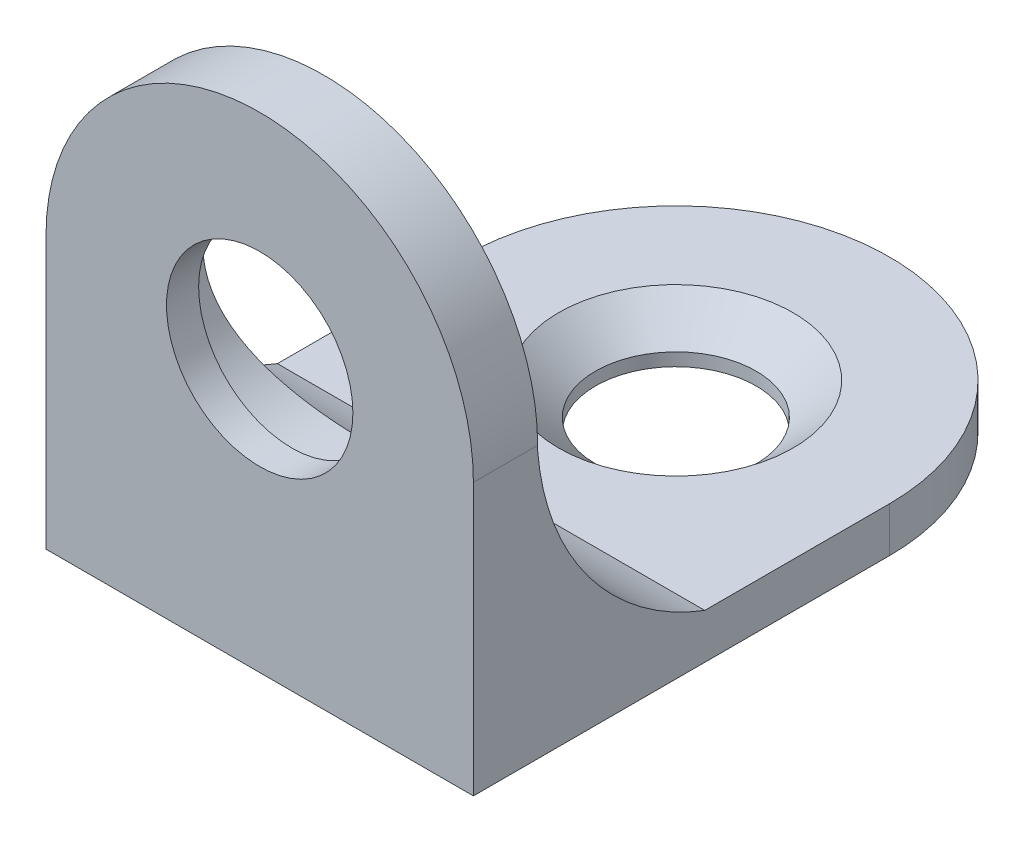
ISO-10303-21;
HEADER;
FILE_DESCRIPTION(('STEP AP214'),'2;1');
FILE_NAME('part.step','',(''),(''),'','','');
FILE_SCHEMA(('AUTOMOTIVE_DESIGN { 1 0 10303 214 1 1 1 1 }'));
ENDSEC;
DATA;
#1=APPLICATION_CONTEXT('core data for automotive mechanical design processes');
#2=APPLICATION_PROTOCOL_DEFINITION('international standard','automotive_design',2000,#1);
#3=PRODUCT_CONTEXT('',#1,'mechanical');
#4=PRODUCT('Part','Part','',(#3));
#5=PRODUCT_RELATED_PRODUCT_CATEGORY('part','',(#4));
#6=PRODUCT_DEFINITION_FORMATION('','',#4);
#7=PRODUCT_DEFINITION_CONTEXT('part definition',#1,'design');
#8=PRODUCT_DEFINITION('design','',#6,#7);
#9=PRODUCT_DEFINITION_SHAPE('','',#8);
#10=(LENGTH_UNIT() NAMED_UNIT(*) SI_UNIT(.MILLI.,.METRE.));
#11=(NAMED_UNIT(*) PLANE_ANGLE_UNIT() SI_UNIT($,.RADIAN.));
#12=(NAMED_UNIT(*) SI_UNIT($,.STERADIAN.) SOLID_ANGLE_UNIT());
#13=UNCERTAINTY_MEASURE_WITH_UNIT(LENGTH_MEASURE(1.E-05),#10,'distance_accuracy_value','');
#14=(GEOMETRIC_REPRESENTATION_CONTEXT(3) GLOBAL_UNCERTAINTY_ASSIGNED_CONTEXT((#13)) GLOBAL_UNIT_ASSIGNED_CONTEXT((#10,
#11,#12)) REPRESENTATION_CONTEXT('',''));
#15=CARTESIAN_POINT('',(0.,0.,0.));
#16=DIRECTION('',(0.,0.,1.));
#17=DIRECTION('',(1.,0.,0.));
#18=AXIS2_PLACEMENT_3D('',#15,#16,#17);
#19=CARTESIAN_POINT('',(15.2900231481171,8.95564166966624,-10.0478706770571));
#20=DIRECTION('',(-1.,0.,0.));
#21=DIRECTION('',(0.,-1.,0.));
#22=AXIS2_PLACEMENT_3D('',#19,#20,#21);
#23=CYLINDRICAL_SURFACE('',#22,8.07453332605907);
#24=CARTESIAN_POINT('',(3.74699879903904,8.3,-2.));
#25=CARTESIAN_POINT('',(3.74291485876346,8.1976098001667,-2.00832387049698));
#26=CARTESIAN_POINT('',(3.73461205588498,8.09556854426683,-2.01862100317612));
#27=CARTESIAN_POINT('',(3.70980008375999,7.892988681728,-2.04292320513637));
#28=CARTESIAN_POINT('',(3.69329527180396,7.79244930640051,-2.05692630379084));
#29=CARTESIAN_POINT('',(3.65240030523719,7.59402611282084,-2.08833860708189));
#30=CARTESIAN_POINT('',(3.62804685202852,7.49613218929321,-2.1057318123219));
#31=CARTESIAN_POINT('',(3.57175426556604,7.30318604765189,-2.1436210907963));
#32=CARTESIAN_POINT('',(3.53981433563504,7.2081341291662,-2.16411748982375));
#33=CARTESIAN_POINT('',(3.43324091041984,6.92847595631397,-2.22961192961201));
#34=CARTESIAN_POINT('',(3.34774196951959,6.74883503667956,-2.2787023683403));
#35=CARTESIAN_POINT('',(3.15066507152923,6.40674161897948,-2.38409992703499));
#36=CARTESIAN_POINT('',(3.03905578144169,6.24431011555158,-2.44041568058173));
#37=CARTESIAN_POINT('',(2.78382821520662,5.92872332548249,-2.56012875070217));
#38=CARTESIAN_POINT('',(2.63850999427154,5.777025461594,-2.62374551679492));
#39=CARTESIAN_POINT('',(2.32390901680427,5.49941716569682,-2.74884255790378));
#40=CARTESIAN_POINT('',(2.15461272215483,5.37352140059767,-2.81032160136097));
#41=CARTESIAN_POINT('',(1.88115645876374,5.20408339649816,-2.8974720917908));
#42=CARTESIAN_POINT('',(1.78443150846563,5.14989767848897,-2.92623899765284));
#43=CARTESIAN_POINT('',(1.58584678300808,5.05001095997185,-2.98052586187395));
#44=CARTESIAN_POINT('',(1.48398963835808,5.00430566795127,-3.00604746044915));
#45=CARTESIAN_POINT('',(1.27585944080838,4.92194117707671,-3.05290131444198));
#46=CARTESIAN_POINT('',(1.16959051688238,4.88527373319787,-3.07423738456788));
#47=CARTESIAN_POINT('',(0.953363643170419,4.82146096951306,-3.11187653362804));
#48=CARTESIAN_POINT('',(0.843406370526411,4.79431391223441,-3.12818053085152));
#49=CARTESIAN_POINT('',(0.632841931519235,4.75239833386119,-3.15357109466395));
#50=CARTESIAN_POINT('',(0.532508375983651,4.73660917600894,-3.16324719978742));
#51=CARTESIAN_POINT('',(0.33054501823249,4.71321372279128,-3.17763897655065));
#52=CARTESIAN_POINT('',(0.228915387625704,4.70560635525546,-3.18235529813601));
#53=CARTESIAN_POINT('',(0.0253076929008794,4.69870350756736,-3.18663276172307));
#54=CARTESIAN_POINT('',(-0.0766701824457447,4.69940407472819,-3.18619635525153));
#55=CARTESIAN_POINT('',(-0.28004942430995,4.70908398706478,-3.18020320069723));
#56=CARTESIAN_POINT('',(-0.38145082325202,4.71806286188948,-3.17464674352191));
#57=CARTESIAN_POINT('',(-0.66077830498014,4.75429562711053,-3.15239435185528));
#58=CARTESIAN_POINT('',(-0.837236813068188,4.79031265507955,-3.13040676601196));
#59=CARTESIAN_POINT('',(-1.18114573427493,4.88638256445256,-3.0734696235295));
#60=CARTESIAN_POINT('',(-1.34859330656127,4.94644297611327,-3.03851600625187));
#61=CARTESIAN_POINT('',(-1.68151716269395,5.09290473317916,-2.95669322086887));
#62=CARTESIAN_POINT('',(-1.84622304749621,5.18071208498628,-2.90921814971314));
#63=CARTESIAN_POINT('',(-2.159521389879,5.37862457879804,-2.80802419377499));
#64=CARTESIAN_POINT('',(-2.30810558309223,5.4887410748558,-2.7543021355958));
#65=CARTESIAN_POINT('',(-2.60673117380471,5.74600958733659,-2.63713351170787));
#66=CARTESIAN_POINT('',(-2.75404951081887,5.8961905648318,-2.57338043477798));
#67=CARTESIAN_POINT('',(-3.02222928362361,6.22002398685482,-2.4488898071638));
#68=CARTESIAN_POINT('',(-3.1430713527394,6.39369346340555,-2.38815448883097));
#69=CARTESIAN_POINT('',(-3.30395534822506,6.67275955664159,-2.30212304488978));
#70=CARTESIAN_POINT('',(-3.35498236311811,6.77103427486924,-2.27378154889475));
#71=CARTESIAN_POINT('',(-3.44838531210478,6.97235547191037,-2.22000426243889));
#72=CARTESIAN_POINT('',(-3.49076523457124,7.07539972380123,-2.19456713476649));
#73=CARTESIAN_POINT('',(-3.56631020461989,7.28537081169387,-2.14724732526959));
#74=CARTESIAN_POINT('',(-3.59949242195658,7.39228998632336,-2.12535805268115));
#75=CARTESIAN_POINT('',(-3.65627172921012,7.60931948571431,-2.08560594270645));
#76=CARTESIAN_POINT('',(-3.6798750825373,7.71942767461516,-2.06774047765264));
#77=CARTESIAN_POINT('',(-3.71146334776643,7.90805860258201,-2.04120037420157));
#78=CARTESIAN_POINT('',(-3.72201517764016,7.98600085762441,-2.03138309657513));
#79=CARTESIAN_POINT('',(-3.73820470458383,8.14255938304241,-2.01399215418807));
#80=CARTESIAN_POINT('',(-3.74384745347586,8.22117487624426,-2.00641618825796));
#81=CARTESIAN_POINT('',(-3.74699879903912,8.29999999999998,-1.99999999999996));
#82=B_SPLINE_CURVE_WITH_KNOTS('',3,(#24,#25,#26,#27,#28,#29,#30,#31,#32,#33,#34,#35,#36,#37,#38,
#39,#40,#41,#42,#43,#44,#45,#46,#47,#48,#49,#50,#51,#52,#53,#54,#55,#56,#57,#58,#59,#60,#61,#62,
#63,#64,#65,#66,#67,#68,#69,#70,#71,#72,#73,#74,#75,#76,#77,#78,#79,#80,#81),.UNSPECIFIED.,.F.,
.F.,(4,2,2,2,2,2,2,2,2,2,2,2,2,2,2,2,2,2,2,2,2,2,2,2,2,2,2,2,4),(0.,0.308292018118875,
0.616420431915365,0.923128403990541,1.22986859858085,1.84171708455116,2.45430360302522,
3.11000364498626,3.76607538467049,4.10930148592707,4.45235342133794,4.79509123015687,
5.13776645665894,5.44341181204933,5.74901710972125,6.05447701463111,6.35991956520424,
6.90158669112933,7.44342359713733,8.01896173777121,8.59479353292192,9.25145404184599,
9.90859328835579,10.2511122726607,10.593472915067,10.9351900866729,11.2766834554535,
11.5142981497846,11.7516680300842),.UNSPECIFIED.);
#83=CARTESIAN_POINT('',(3.74699879903904,8.3,-2.));
#84=VERTEX_POINT('',#83);
#85=CARTESIAN_POINT('',(-3.74699879903904,8.29999999999999,-2.));
#86=VERTEX_POINT('',#85);
#87=EDGE_CURVE('E57',#84,#86,#82,.T.);
#88=ORIENTED_EDGE('',*,*,#87,.F.);
#89=DIRECTION('',(-1.,0.,0.));
#90=VECTOR('',#89,1.);
#91=CARTESIAN_POINT('',(15.2900231481171,8.3,-2.));
#92=LINE('',#91,#90);
#93=CARTESIAN_POINT('',(6.65,8.3,-2.));
#94=VERTEX_POINT('',#93);
#95=EDGE_CURVE('E113',#94,#84,#92,.T.);
#96=ORIENTED_EDGE('',*,*,#95,.F.);
#97=CARTESIAN_POINT('',(6.65,8.95564166966624,-10.0478706770571));
#98=DIRECTION('',(1.,0.,0.));
#99=DIRECTION('',(0.,0.,-1.));
#100=AXIS2_PLACEMENT_3D('',#97,#98,#99);
#101=CIRCLE('',#100,8.07453332605907);
#102=CARTESIAN_POINT('',(6.65,1.4,-7.2));
#103=VERTEX_POINT('',#102);
#104=EDGE_CURVE('E121',#103,#94,#101,.F.);
#105=ORIENTED_EDGE('',*,*,#104,.F.);
#106=DIRECTION('',(-1.,0.,0.));
#107=VECTOR('',#106,1.);
#108=CARTESIAN_POINT('',(15.2900231481171,1.40000000000001,-7.2));
#109=LINE('',#108,#107);
#110=CARTESIAN_POINT('',(-6.65,1.4,-7.2));
#111=VERTEX_POINT('',#110);
#112=EDGE_CURVE('E122',#103,#111,#109,.T.);
#113=ORIENTED_EDGE('',*,*,#112,.T.);
#114=CARTESIAN_POINT('',(-6.65,8.95564166966624,-10.0478706770571));
#115=DIRECTION('',(-1.,0.,0.));
#116=DIRECTION('',(0.,-1.,0.));
#117=AXIS2_PLACEMENT_3D('',#114,#115,#116);
#118=CIRCLE('',#117,8.07453332605907);
#119=CARTESIAN_POINT('',(-6.65,8.29999999999999,-2.));
#120=VERTEX_POINT('',#119);
#121=EDGE_CURVE('E119',#111,#120,#118,.T.);
#122=ORIENTED_EDGE('',*,*,#121,.T.);
#123=EDGE_CURVE('E64',#86,#120,#92,.T.);
#124=ORIENTED_EDGE('',*,*,#123,.F.);
#125=EDGE_LOOP('',(#88,#96,#105,#113,#122,#124));
#126=FACE_BOUND('',#125,.T.);
#127=ADVANCED_FACE('F38',(#126),#23,.F.);
#128=CARTESIAN_POINT('',(0.,8.45,-2.));
#129=DIRECTION('',(0.,0.,1.));
#130=DIRECTION('',(1.,0.,0.));
#131=AXIS2_PLACEMENT_3D('',#128,#129,#130);
#132=CYLINDRICAL_SURFACE('',#131,2.9);
#133=CARTESIAN_POINT('',(0.,8.45,0.));
#134=DIRECTION('',(0.,0.,1.));
#135=DIRECTION('',(1.,0.,0.));
#136=AXIS2_PLACEMENT_3D('',#133,#134,#135);
#137=CIRCLE('',#136,2.9);
#138=CARTESIAN_POINT('',(2.9,8.45,0.));
#139=VERTEX_POINT('',#138);
#140=EDGE_CURVE('E146',#139,#139,#137,.T.);
#141=ORIENTED_EDGE('',*,*,#140,.T.);
#142=EDGE_LOOP('',(#141));
#143=FACE_BOUND('',#142,.T.);
#144=CARTESIAN_POINT('',(0.,8.45,-1.));
#145=DIRECTION('',(0.,0.,-1.));
#146=DIRECTION('',(-1.,0.,0.));
#147=AXIS2_PLACEMENT_3D('',#144,#145,#146);
#148=CIRCLE('',#147,2.9);
#149=CARTESIAN_POINT('',(-2.9,8.45,-1.));
#150=VERTEX_POINT('',#149);
#151=EDGE_CURVE('E127',#150,#150,#148,.F.);
#152=ORIENTED_EDGE('',*,*,#151,.F.);
#153=EDGE_LOOP('',(#152));
#154=FACE_BOUND('',#153,.T.);
#155=ADVANCED_FACE('F205',(#143,#154),#132,.F.);
#156=CARTESIAN_POINT('',(0.,8.45,-2.));
#157=DIRECTION('',(0.,0.,1.));
#158=DIRECTION('',(1.,0.,0.));
#159=AXIS2_PLACEMENT_3D('',#156,#157,#158);
#160=PLANE('',#159);
#161=ORIENTED_EDGE('',*,*,#95,.T.);
#162=CARTESIAN_POINT('',(0.,8.45,-2.));
#163=DIRECTION('',(0.,0.,-1.));
#164=DIRECTION('',(-1.,0.,0.));
#165=AXIS2_PLACEMENT_3D('',#162,#163,#164);
#166=CIRCLE('',#165,3.75);
#167=EDGE_CURVE('E108',#86,#84,#166,.T.);
#168=ORIENTED_EDGE('',*,*,#167,.F.);
#169=ORIENTED_EDGE('',*,*,#123,.T.);
#170=DIRECTION('',(0.,-1.,0.));
#171=VECTOR('',#170,1.);
#172=CARTESIAN_POINT('',(-6.65,8.45,-2.));
#173=LINE('',#172,#171);
#174=CARTESIAN_POINT('',(-6.65,8.45,-2.));
#175=VERTEX_POINT('',#174);
#176=EDGE_CURVE('E153',#175,#120,#173,.T.);
#177=ORIENTED_EDGE('',*,*,#176,.F.);
#178=CARTESIAN_POINT('',(0.,8.45,-2.));
#179=DIRECTION('',(0.,0.,1.));
#180=DIRECTION('',(1.,0.,0.));
#181=AXIS2_PLACEMENT_3D('',#178,#179,#180);
#182=CIRCLE('',#181,6.65);
#183=CARTESIAN_POINT('',(6.65,8.45,-2.));
#184=VERTEX_POINT('',#183);
#185=EDGE_CURVE('E150',#184,#175,#182,.T.);
#186=ORIENTED_EDGE('',*,*,#185,.F.);
#187=DIRECTION('',(0.,1.,0.));
#188=VECTOR('',#187,1.);
#189=CARTESIAN_POINT('',(6.65,8.45,-2.));
#190=LINE('',#189,#188);
#191=EDGE_CURVE('E156',#94,#184,#190,.T.);
#192=ORIENTED_EDGE('',*,*,#191,.F.);
#193=EDGE_LOOP('',(#161,#168,#169,#177,#186,#192));
#194=FACE_BOUND('',#193,.T.);
#195=ADVANCED_FACE('F112',(#194),#160,.F.);
#196=CARTESIAN_POINT('',(0.,1.4,-12.95));
#197=DIRECTION('',(0.,1.,0.));
#198=DIRECTION('',(0.,0.,1.));
#199=AXIS2_PLACEMENT_3D('',#196,#197,#198);
#200=PLANE('',#199);
#201=CARTESIAN_POINT('',(0.,1.4,-12.95));
#202=DIRECTION('',(0.,1.,0.));
#203=DIRECTION('',(0.,0.,1.));
#204=AXIS2_PLACEMENT_3D('',#201,#202,#203);
#205=CIRCLE('',#204,3.65);
#206=CARTESIAN_POINT('',(0.,1.4,-9.3));
#207=VERTEX_POINT('',#206);
#208=EDGE_CURVE('E110',#207,#207,#205,.T.);
#209=ORIENTED_EDGE('',*,*,#208,.F.);
#210=EDGE_LOOP('',(#209));
#211=FACE_BOUND('',#210,.T.);
#212=DIRECTION('',(0.,0.,1.));
#213=VECTOR('',#212,1.);
#214=CARTESIAN_POINT('',(-6.65,1.4,0.));
#215=LINE('',#214,#213);
#216=CARTESIAN_POINT('',(-6.65,1.4,-12.95));
#217=VERTEX_POINT('',#216);
#218=EDGE_CURVE('E136',#217,#111,#215,.T.);
#219=ORIENTED_EDGE('',*,*,#218,.T.);
#220=ORIENTED_EDGE('',*,*,#112,.F.);
#221=DIRECTION('',(0.,0.,-1.));
#222=VECTOR('',#221,1.);
#223=CARTESIAN_POINT('',(6.65,1.4,0.));
#224=LINE('',#223,#222);
#225=CARTESIAN_POINT('',(6.65,1.4,-12.95));
#226=VERTEX_POINT('',#225);
#227=EDGE_CURVE('E132',#103,#226,#224,.T.);
#228=ORIENTED_EDGE('',*,*,#227,.T.);
#229=CARTESIAN_POINT('',(0.,1.4,-12.95));
#230=DIRECTION('',(0.,1.,0.));
#231=DIRECTION('',(0.,0.,1.));
#232=AXIS2_PLACEMENT_3D('',#229,#230,#231);
#233=CIRCLE('',#232,6.65);
#234=EDGE_CURVE('E134',#226,#217,#233,.T.);
#235=ORIENTED_EDGE('',*,*,#234,.T.);
#236=EDGE_LOOP('',(#219,#220,#228,#235));
#237=FACE_BOUND('',#236,.T.);
#238=ADVANCED_FACE('F196',(#211,#237),#200,.T.);
#239=CARTESIAN_POINT('',(0.,8.45,-2.));
#240=DIRECTION('',(0.,0.,1.));
#241=DIRECTION('',(1.,0.,0.));
#242=AXIS2_PLACEMENT_3D('',#239,#240,#241);
#243=CYLINDRICAL_SURFACE('',#242,6.65);
#244=CARTESIAN_POINT('',(0.,8.45,0.));
#245=DIRECTION('',(0.,0.,1.));
#246=DIRECTION('',(1.,0.,0.));
#247=AXIS2_PLACEMENT_3D('',#244,#245,#246);
#248=CIRCLE('',#247,6.65);
#249=CARTESIAN_POINT('',(6.65,8.45,0.));
#250=VERTEX_POINT('',#249);
#251=CARTESIAN_POINT('',(-6.65,8.45,0.));
#252=VERTEX_POINT('',#251);
#253=EDGE_CURVE('E149',#250,#252,#248,.T.);
#254=ORIENTED_EDGE('',*,*,#253,.F.);
#255=DIRECTION('',(0.,0.,1.));
#256=VECTOR('',#255,1.);
#257=CARTESIAN_POINT('',(6.65,8.45,-2.));
#258=LINE('',#257,#256);
#259=EDGE_CURVE('E12',#184,#250,#258,.T.);
#260=ORIENTED_EDGE('',*,*,#259,.F.);
#261=ORIENTED_EDGE('',*,*,#185,.T.);
#262=DIRECTION('',(0.,0.,1.));
#263=VECTOR('',#262,1.);
#264=CARTESIAN_POINT('',(-6.65,8.45,-2.));
#265=LINE('',#264,#263);
#266=EDGE_CURVE('E158',#175,#252,#265,.T.);
#267=ORIENTED_EDGE('',*,*,#266,.T.);
#268=EDGE_LOOP('',(#254,#260,#261,#267));
#269=FACE_BOUND('',#268,.T.);
#270=ADVANCED_FACE('F40',(#269),#243,.T.);
#271=CARTESIAN_POINT('',(6.65,8.45,-2.));
#272=DIRECTION('',(1.,0.,0.));
#273=DIRECTION('',(0.,0.,-1.));
#274=AXIS2_PLACEMENT_3D('',#271,#272,#273);
#275=PLANE('',#274);
#276=ORIENTED_EDGE('',*,*,#104,.T.);
#277=ORIENTED_EDGE('',*,*,#191,.T.);
#278=ORIENTED_EDGE('',*,*,#259,.T.);
#279=DIRECTION('',(0.,1.,0.));
#280=VECTOR('',#279,1.);
#281=CARTESIAN_POINT('',(6.65,8.45,0.));
#282=LINE('',#281,#280);
#283=CARTESIAN_POINT('',(6.65,0.,0.));
#284=VERTEX_POINT('',#283);
#285=EDGE_CURVE('E154',#284,#250,#282,.T.);
#286=ORIENTED_EDGE('',*,*,#285,.F.);
#287=DIRECTION('',(0.,0.,1.));
#288=VECTOR('',#287,1.);
#289=CARTESIAN_POINT('',(6.65,0.,-2.));
#290=LINE('',#289,#288);
#291=CARTESIAN_POINT('',(6.65,0.,-12.95));
#292=VERTEX_POINT('',#291);
#293=EDGE_CURVE('E49',#292,#284,#290,.T.);
#294=ORIENTED_EDGE('',*,*,#293,.F.);
#295=DIRECTION('',(0.,-1.,0.));
#296=VECTOR('',#295,1.);
#297=CARTESIAN_POINT('',(6.65,1.4,-12.95));
#298=LINE('',#297,#296);
#299=EDGE_CURVE('E143',#226,#292,#298,.T.);
#300=ORIENTED_EDGE('',*,*,#299,.F.);
#301=ORIENTED_EDGE('',*,*,#227,.F.);
#302=EDGE_LOOP('',(#276,#277,#278,#286,#294,#300,#301));
#303=FACE_BOUND('',#302,.T.);
#304=ADVANCED_FACE('F215',(#303),#275,.T.);
#305=CARTESIAN_POINT('',(-6.65,0.,-2.));
#306=DIRECTION('',(0.,-1.,0.));
#307=DIRECTION('',(0.,0.,-1.));
#308=AXIS2_PLACEMENT_3D('',#305,#306,#307);
#309=PLANE('',#308);
#310=DIRECTION('',(1.,0.,0.));
#311=VECTOR('',#310,1.);
#312=CARTESIAN_POINT('',(-6.65,0.,0.));
#313=LINE('',#312,#311);
#314=CARTESIAN_POINT('',(-6.65,0.,0.));
#315=VERTEX_POINT('',#314);
#316=EDGE_CURVE('E163',#315,#284,#313,.T.);
#317=ORIENTED_EDGE('',*,*,#316,.F.);
#318=DIRECTION('',(0.,0.,1.));
#319=VECTOR('',#318,1.);
#320=CARTESIAN_POINT('',(-6.65,0.,-2.));
#321=LINE('',#320,#319);
#322=CARTESIAN_POINT('',(-6.65,0.,-12.95));
#323=VERTEX_POINT('',#322);
#324=EDGE_CURVE('E168',#323,#315,#321,.T.);
#325=ORIENTED_EDGE('',*,*,#324,.F.);
#326=CARTESIAN_POINT('',(0.,0.,-12.95));
#327=DIRECTION('',(0.,1.,0.));
#328=DIRECTION('',(0.,0.,1.));
#329=AXIS2_PLACEMENT_3D('',#326,#327,#328);
#330=CIRCLE('',#329,6.65);
#331=EDGE_CURVE('E131',#292,#323,#330,.T.);
#332=ORIENTED_EDGE('',*,*,#331,.F.);
#333=ORIENTED_EDGE('',*,*,#293,.T.);
#334=EDGE_LOOP('',(#317,#325,#332,#333));
#335=FACE_BOUND('',#334,.T.);
#336=CARTESIAN_POINT('',(0.,0.,-12.95));
#337=DIRECTION('',(0.,1.,0.));
#338=DIRECTION('',(0.,0.,1.));
#339=AXIS2_PLACEMENT_3D('',#336,#337,#338);
#340=CIRCLE('',#339,2.5);
#341=CARTESIAN_POINT('',(0.,0.,-10.45));
#342=VERTEX_POINT('',#341);
#343=EDGE_CURVE('E128',#342,#342,#340,.T.);
#344=ORIENTED_EDGE('',*,*,#343,.T.);
#345=EDGE_LOOP('',(#344));
#346=FACE_BOUND('',#345,.T.);
#347=ADVANCED_FACE('F218',(#335,#346),#309,.T.);
#348=CARTESIAN_POINT('',(-6.65,8.45,-2.));
#349=DIRECTION('',(-1.,0.,0.));
#350=DIRECTION('',(0.,0.,1.));
#351=AXIS2_PLACEMENT_3D('',#348,#349,#350);
#352=PLANE('',#351);
#353=ORIENTED_EDGE('',*,*,#176,.T.);
#354=ORIENTED_EDGE('',*,*,#121,.F.);
#355=ORIENTED_EDGE('',*,*,#218,.F.);
#356=DIRECTION('',(0.,-1.,0.));
#357=VECTOR('',#356,1.);
#358=CARTESIAN_POINT('',(-6.65,1.4,-12.95));
#359=LINE('',#358,#357);
#360=EDGE_CURVE('E138',#217,#323,#359,.T.);
#361=ORIENTED_EDGE('',*,*,#360,.T.);
#362=ORIENTED_EDGE('',*,*,#324,.T.);
#363=DIRECTION('',(0.,-1.,0.));
#364=VECTOR('',#363,1.);
#365=CARTESIAN_POINT('',(-6.65,8.45,0.));
#366=LINE('',#365,#364);
#367=EDGE_CURVE('E161',#252,#315,#366,.T.);
#368=ORIENTED_EDGE('',*,*,#367,.F.);
#369=ORIENTED_EDGE('',*,*,#266,.F.);
#370=EDGE_LOOP('',(#353,#354,#355,#361,#362,#368,#369));
#371=FACE_BOUND('',#370,.T.);
#372=ADVANCED_FACE('F213',(#371),#352,.T.);
#373=CARTESIAN_POINT('',(0.,8.45,0.));
#374=DIRECTION('',(0.,0.,1.));
#375=DIRECTION('',(1.,0.,0.));
#376=AXIS2_PLACEMENT_3D('',#373,#374,#375);
#377=PLANE('',#376);
#378=ORIENTED_EDGE('',*,*,#367,.T.);
#379=ORIENTED_EDGE('',*,*,#316,.T.);
#380=ORIENTED_EDGE('',*,*,#285,.T.);
#381=ORIENTED_EDGE('',*,*,#253,.T.);
#382=EDGE_LOOP('',(#378,#379,#380,#381));
#383=FACE_BOUND('',#382,.T.);
#384=ORIENTED_EDGE('',*,*,#140,.F.);
#385=EDGE_LOOP('',(#384));
#386=FACE_BOUND('',#385,.T.);
#387=ADVANCED_FACE('F203',(#383,#386),#377,.T.);
#388=CARTESIAN_POINT('',(0.,1.4,-12.95));
#389=DIRECTION('',(0.,-1.,0.));
#390=DIRECTION('',(0.,0.,-1.));
#391=AXIS2_PLACEMENT_3D('',#388,#389,#390);
#392=CYLINDRICAL_SURFACE('',#391,6.65);
#393=ORIENTED_EDGE('',*,*,#331,.T.);
#394=ORIENTED_EDGE('',*,*,#360,.F.);
#395=ORIENTED_EDGE('',*,*,#234,.F.);
#396=ORIENTED_EDGE('',*,*,#299,.T.);
#397=EDGE_LOOP('',(#393,#394,#395,#396));
#398=FACE_BOUND('',#397,.T.);
#399=ADVANCED_FACE('F193',(#398),#392,.T.);
#400=CARTESIAN_POINT('',(0.,1.4,-12.95));
#401=DIRECTION('',(0.,-1.,0.));
#402=DIRECTION('',(0.,0.,-1.));
#403=AXIS2_PLACEMENT_3D('',#400,#401,#402);
#404=CYLINDRICAL_SURFACE('',#403,2.5);
#405=CARTESIAN_POINT('',(0.,0.4,-12.95));
#406=DIRECTION('',(0.,1.,0.));
#407=DIRECTION('',(0.,0.,1.));
#408=AXIS2_PLACEMENT_3D('',#405,#406,#407);
#409=CIRCLE('',#408,2.5);
#410=CARTESIAN_POINT('',(0.,0.4,-10.45));
#411=VERTEX_POINT('',#410);
#412=EDGE_CURVE('E178',#411,#411,#409,.T.);
#413=ORIENTED_EDGE('',*,*,#412,.T.);
#414=EDGE_LOOP('',(#413));
#415=FACE_BOUND('',#414,.T.);
#416=ORIENTED_EDGE('',*,*,#343,.F.);
#417=EDGE_LOOP('',(#416));
#418=FACE_BOUND('',#417,.T.);
#419=ADVANCED_FACE('F183',(#415,#418),#404,.F.);
#420=CARTESIAN_POINT('',(0.,8.45,-1.));
#421=DIRECTION('',(0.,0.,-1.));
#422=DIRECTION('',(-1.,0.,0.));
#423=AXIS2_PLACEMENT_3D('',#420,#421,#422);
#424=PLANE('',#423);
#425=CARTESIAN_POINT('',(0.,8.45,-1.));
#426=DIRECTION('',(0.,0.,-1.));
#427=DIRECTION('',(-1.,0.,0.));
#428=AXIS2_PLACEMENT_3D('',#425,#426,#427);
#429=CIRCLE('',#428,3.75);
#430=CARTESIAN_POINT('',(-3.75,8.45,-1.));
#431=VERTEX_POINT('',#430);
#432=EDGE_CURVE('E114',#431,#431,#429,.T.);
#433=ORIENTED_EDGE('',*,*,#432,.T.);
#434=EDGE_LOOP('',(#433));
#435=FACE_BOUND('',#434,.T.);
#436=ORIENTED_EDGE('',*,*,#151,.T.);
#437=EDGE_LOOP('',(#436));
#438=FACE_BOUND('',#437,.T.);
#439=ADVANCED_FACE('F192',(#435,#438),#424,.T.);
#440=CARTESIAN_POINT('',(0.,8.45,-1.));
#441=DIRECTION('',(0.,0.,-1.));
#442=DIRECTION('',(-1.,0.,0.));
#443=AXIS2_PLACEMENT_3D('',#440,#441,#442);
#444=CYLINDRICAL_SURFACE('',#443,3.75);
#445=ORIENTED_EDGE('',*,*,#432,.F.);
#446=EDGE_LOOP('',(#445));
#447=FACE_BOUND('',#446,.T.);
#448=ORIENTED_EDGE('',*,*,#167,.T.);
#449=ORIENTED_EDGE('',*,*,#87,.T.);
#450=EDGE_LOOP('',(#448,#449));
#451=FACE_BOUND('',#450,.T.);
#452=ADVANCED_FACE('F107',(#447,#451),#444,.F.);
#453=CARTESIAN_POINT('',(0.,0.4,-12.95));
#454=DIRECTION('',(0.,1.,0.));
#455=DIRECTION('',(0.,0.,1.));
#456=AXIS2_PLACEMENT_3D('',#453,#454,#455);
#457=CONICAL_SURFACE('',#456,2.5,0.855052737126016);
#458=ORIENTED_EDGE('',*,*,#412,.F.);
#459=EDGE_LOOP('',(#458));
#460=FACE_BOUND('',#459,.T.);
#461=ORIENTED_EDGE('',*,*,#208,.T.);
#462=EDGE_LOOP('',(#461));
#463=FACE_BOUND('',#462,.T.);
#464=ADVANCED_FACE('F291',(#460,#463),#457,.F.);
#465=CLOSED_SHELL('',(#127,#155,#195,#238,#270,#304,#347,#372,#387,#399,#419,#439,#452,#464));
#466=MANIFOLD_SOLID_BREP('B2',#465);
#467=ADVANCED_BREP_SHAPE_REPRESENTATION('',(#18,#466),#14);
#468=SHAPE_DEFINITION_REPRESENTATION(#9,#467);
ENDSEC;
END-ISO-10303-21;
